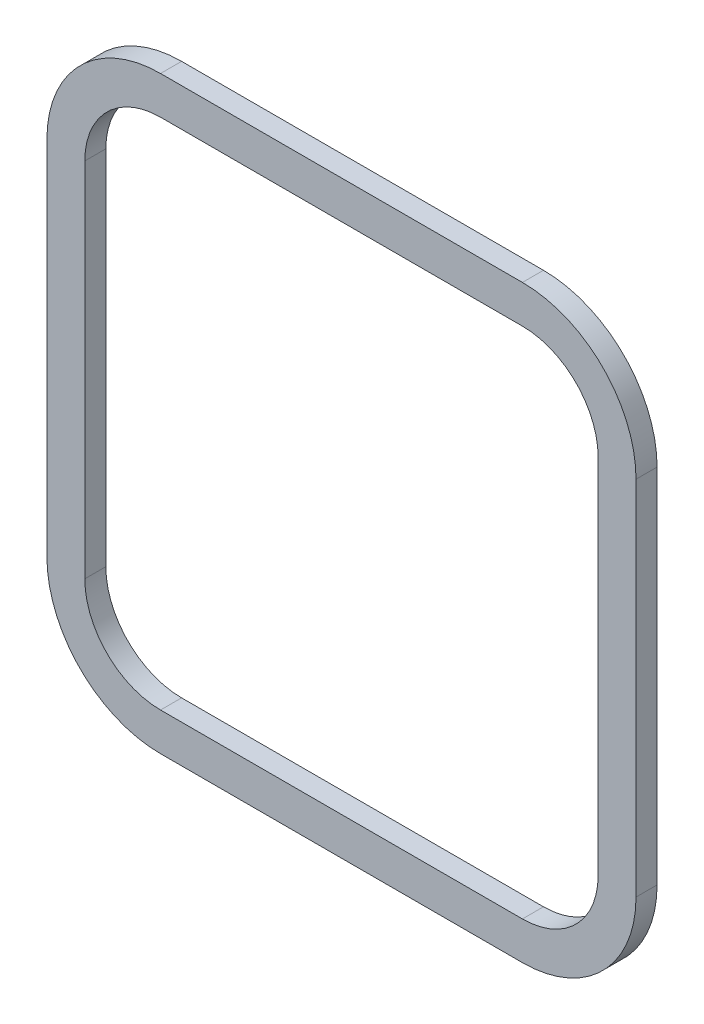
ISO-10303-21;
HEADER;
FILE_DESCRIPTION(('STEP AP214'),'2;1');
FILE_NAME('part.step','',(''),(''),'','','');
FILE_SCHEMA(('AUTOMOTIVE_DESIGN { 1 0 10303 214 1 1 1 1 }'));
ENDSEC;
DATA;
#1=APPLICATION_CONTEXT('core data for automotive mechanical design processes');
#2=APPLICATION_PROTOCOL_DEFINITION('international standard','automotive_design',2000,#1);
#3=PRODUCT_CONTEXT('',#1,'mechanical');
#4=PRODUCT('Part','Part','',(#3));
#5=PRODUCT_RELATED_PRODUCT_CATEGORY('part','',(#4));
#6=PRODUCT_DEFINITION_FORMATION('','',#4);
#7=PRODUCT_DEFINITION_CONTEXT('part definition',#1,'design');
#8=PRODUCT_DEFINITION('design','',#6,#7);
#9=PRODUCT_DEFINITION_SHAPE('','',#8);
#10=(LENGTH_UNIT() NAMED_UNIT(*) SI_UNIT(.MILLI.,.METRE.));
#11=(NAMED_UNIT(*) PLANE_ANGLE_UNIT() SI_UNIT($,.RADIAN.));
#12=(NAMED_UNIT(*) SI_UNIT($,.STERADIAN.) SOLID_ANGLE_UNIT());
#13=UNCERTAINTY_MEASURE_WITH_UNIT(LENGTH_MEASURE(1.E-05),#10,'distance_accuracy_value','');
#14=(GEOMETRIC_REPRESENTATION_CONTEXT(3) GLOBAL_UNCERTAINTY_ASSIGNED_CONTEXT((#13)) GLOBAL_UNIT_ASSIGNED_CONTEXT((#10,
#11,#12)) REPRESENTATION_CONTEXT('',''));
#15=CARTESIAN_POINT('',(0.,0.,0.));
#16=DIRECTION('',(0.,0.,1.));
#17=DIRECTION('',(1.,0.,0.));
#18=AXIS2_PLACEMENT_3D('',#15,#16,#17);
#19=CARTESIAN_POINT('',(-140.,-140.,10.));
#20=DIRECTION('',(0.,0.,1.));
#21=DIRECTION('',(1.,0.,0.));
#22=AXIS2_PLACEMENT_3D('',#19,#20,#21);
#23=PLANE('',#22);
#24=DIRECTION('',(0.,-1.,0.));
#25=VECTOR('',#24,1.);
#26=CARTESIAN_POINT('',(-140.,140.,10.));
#27=LINE('',#26,#25);
#28=CARTESIAN_POINT('',(-140.,86.,10.));
#29=VERTEX_POINT('',#28);
#30=CARTESIAN_POINT('',(-140.,-86.,10.));
#31=VERTEX_POINT('',#30);
#32=EDGE_CURVE('E246',#29,#31,#27,.T.);
#33=ORIENTED_EDGE('',*,*,#32,.T.);
#34=CARTESIAN_POINT('',(-86.0000000000001,-86.,10.));
#35=DIRECTION('',(0.,0.,1.));
#36=DIRECTION('',(1.,0.,0.));
#37=AXIS2_PLACEMENT_3D('',#34,#35,#36);
#38=CIRCLE('',#37,54.);
#39=CARTESIAN_POINT('',(-86.0000000000001,-140.,10.));
#40=VERTEX_POINT('',#39);
#41=EDGE_CURVE('E230',#31,#40,#38,.T.);
#42=ORIENTED_EDGE('',*,*,#41,.T.);
#43=DIRECTION('',(1.,0.,0.));
#44=VECTOR('',#43,1.);
#45=CARTESIAN_POINT('',(-140.,-140.,10.));
#46=LINE('',#45,#44);
#47=CARTESIAN_POINT('',(86.0000000000001,-140.,10.));
#48=VERTEX_POINT('',#47);
#49=EDGE_CURVE('E249',#40,#48,#46,.T.);
#50=ORIENTED_EDGE('',*,*,#49,.T.);
#51=CARTESIAN_POINT('',(86.0000000000001,-86.,10.));
#52=DIRECTION('',(0.,0.,1.));
#53=DIRECTION('',(1.,0.,0.));
#54=AXIS2_PLACEMENT_3D('',#51,#52,#53);
#55=CIRCLE('',#54,54.);
#56=CARTESIAN_POINT('',(140.,-86.,10.));
#57=VERTEX_POINT('',#56);
#58=EDGE_CURVE('E228',#48,#57,#55,.T.);
#59=ORIENTED_EDGE('',*,*,#58,.T.);
#60=DIRECTION('',(0.,1.,0.));
#61=VECTOR('',#60,1.);
#62=CARTESIAN_POINT('',(140.,140.,10.));
#63=LINE('',#62,#61);
#64=CARTESIAN_POINT('',(140.,86.0000000000001,10.));
#65=VERTEX_POINT('',#64);
#66=EDGE_CURVE('E176',#57,#65,#63,.T.);
#67=ORIENTED_EDGE('',*,*,#66,.T.);
#68=CARTESIAN_POINT('',(86.,86.,10.));
#69=DIRECTION('',(0.,0.,1.));
#70=DIRECTION('',(1.,0.,0.));
#71=AXIS2_PLACEMENT_3D('',#68,#69,#70);
#72=CIRCLE('',#71,54.);
#73=CARTESIAN_POINT('',(86.,140.,10.));
#74=VERTEX_POINT('',#73);
#75=EDGE_CURVE('E54',#65,#74,#72,.T.);
#76=ORIENTED_EDGE('',*,*,#75,.T.);
#77=DIRECTION('',(-1.,0.,0.));
#78=VECTOR('',#77,1.);
#79=CARTESIAN_POINT('',(-140.,140.,10.));
#80=LINE('',#79,#78);
#81=CARTESIAN_POINT('',(-86.0000000000001,140.,10.));
#82=VERTEX_POINT('',#81);
#83=EDGE_CURVE('E172',#74,#82,#80,.T.);
#84=ORIENTED_EDGE('',*,*,#83,.T.);
#85=CARTESIAN_POINT('',(-86.0000000000001,86.,10.));
#86=DIRECTION('',(0.,0.,1.));
#87=DIRECTION('',(1.,0.,0.));
#88=AXIS2_PLACEMENT_3D('',#85,#86,#87);
#89=CIRCLE('',#88,54.);
#90=EDGE_CURVE('E226',#82,#29,#89,.T.);
#91=ORIENTED_EDGE('',*,*,#90,.T.);
#92=EDGE_LOOP('',(#33,#42,#50,#59,#67,#76,#84,#91));
#93=FACE_BOUND('',#92,.T.);
#94=DIRECTION('',(1.,0.,0.));
#95=VECTOR('',#94,1.);
#96=CARTESIAN_POINT('',(-122.,-122.,10.));
#97=LINE('',#96,#95);
#98=CARTESIAN_POINT('',(-86.,-122.,10.));
#99=VERTEX_POINT('',#98);
#100=CARTESIAN_POINT('',(86.,-122.,10.));
#101=VERTEX_POINT('',#100);
#102=EDGE_CURVE('E276',#99,#101,#97,.T.);
#103=ORIENTED_EDGE('',*,*,#102,.F.);
#104=CARTESIAN_POINT('',(-86.,-86.,10.));
#105=DIRECTION('',(0.,0.,1.));
#106=DIRECTION('',(1.,0.,0.));
#107=AXIS2_PLACEMENT_3D('',#104,#105,#106);
#108=CIRCLE('',#107,36.);
#109=CARTESIAN_POINT('',(-122.,-85.9999999999999,10.));
#110=VERTEX_POINT('',#109);
#111=EDGE_CURVE('E158',#99,#110,#108,.F.);
#112=ORIENTED_EDGE('',*,*,#111,.T.);
#113=DIRECTION('',(0.,-1.,0.));
#114=VECTOR('',#113,1.);
#115=CARTESIAN_POINT('',(-122.,122.,10.));
#116=LINE('',#115,#114);
#117=CARTESIAN_POINT('',(-122.,86.,10.));
#118=VERTEX_POINT('',#117);
#119=EDGE_CURVE('E265',#118,#110,#116,.T.);
#120=ORIENTED_EDGE('',*,*,#119,.F.);
#121=CARTESIAN_POINT('',(-86.,86.,10.));
#122=DIRECTION('',(0.,0.,1.));
#123=DIRECTION('',(1.,0.,0.));
#124=AXIS2_PLACEMENT_3D('',#121,#122,#123);
#125=CIRCLE('',#124,36.);
#126=CARTESIAN_POINT('',(-86.0000000000001,122.,10.));
#127=VERTEX_POINT('',#126);
#128=EDGE_CURVE('E157',#118,#127,#125,.F.);
#129=ORIENTED_EDGE('',*,*,#128,.T.);
#130=DIRECTION('',(-1.,0.,0.));
#131=VECTOR('',#130,1.);
#132=CARTESIAN_POINT('',(-122.,122.,10.));
#133=LINE('',#132,#131);
#134=CARTESIAN_POINT('',(85.9999999999999,122.,10.));
#135=VERTEX_POINT('',#134);
#136=EDGE_CURVE('E259',#135,#127,#133,.T.);
#137=ORIENTED_EDGE('',*,*,#136,.F.);
#138=CARTESIAN_POINT('',(86.,86.,10.));
#139=DIRECTION('',(0.,0.,1.));
#140=DIRECTION('',(1.,0.,0.));
#141=AXIS2_PLACEMENT_3D('',#138,#139,#140);
#142=CIRCLE('',#141,36.);
#143=CARTESIAN_POINT('',(122.,86.,10.));
#144=VERTEX_POINT('',#143);
#145=EDGE_CURVE('E201',#135,#144,#142,.F.);
#146=ORIENTED_EDGE('',*,*,#145,.T.);
#147=DIRECTION('',(0.,1.,0.));
#148=VECTOR('',#147,1.);
#149=CARTESIAN_POINT('',(122.,122.,10.));
#150=LINE('',#149,#148);
#151=CARTESIAN_POINT('',(122.,-85.9999999999999,10.));
#152=VERTEX_POINT('',#151);
#153=EDGE_CURVE('E273',#152,#144,#150,.T.);
#154=ORIENTED_EDGE('',*,*,#153,.F.);
#155=CARTESIAN_POINT('',(86.,-86.,10.));
#156=DIRECTION('',(0.,0.,1.));
#157=DIRECTION('',(1.,0.,0.));
#158=AXIS2_PLACEMENT_3D('',#155,#156,#157);
#159=CIRCLE('',#158,36.);
#160=EDGE_CURVE('E205',#152,#101,#159,.F.);
#161=ORIENTED_EDGE('',*,*,#160,.T.);
#162=EDGE_LOOP('',(#103,#112,#120,#129,#137,#146,#154,#161));
#163=FACE_BOUND('',#162,.T.);
#164=ADVANCED_FACE('F34',(#93,#163),#23,.T.);
#165=CARTESIAN_POINT('',(-140.,-140.,0.));
#166=DIRECTION('',(0.,0.,1.));
#167=DIRECTION('',(1.,0.,0.));
#168=AXIS2_PLACEMENT_3D('',#165,#166,#167);
#169=PLANE('',#168);
#170=DIRECTION('',(1.,0.,0.));
#171=VECTOR('',#170,1.);
#172=CARTESIAN_POINT('',(-140.,-140.,0.));
#173=LINE('',#172,#171);
#174=CARTESIAN_POINT('',(-86.0000000000001,-140.,0.));
#175=VERTEX_POINT('',#174);
#176=CARTESIAN_POINT('',(86.0000000000001,-140.,0.));
#177=VERTEX_POINT('',#176);
#178=EDGE_CURVE('E251',#175,#177,#173,.T.);
#179=ORIENTED_EDGE('',*,*,#178,.F.);
#180=CARTESIAN_POINT('',(-86.0000000000001,-86.,0.));
#181=DIRECTION('',(0.,0.,1.));
#182=DIRECTION('',(1.,0.,0.));
#183=AXIS2_PLACEMENT_3D('',#180,#181,#182);
#184=CIRCLE('',#183,54.);
#185=CARTESIAN_POINT('',(-140.,-86.,0.));
#186=VERTEX_POINT('',#185);
#187=EDGE_CURVE('E218',#175,#186,#184,.F.);
#188=ORIENTED_EDGE('',*,*,#187,.T.);
#189=DIRECTION('',(0.,-1.,0.));
#190=VECTOR('',#189,1.);
#191=CARTESIAN_POINT('',(-140.,140.,0.));
#192=LINE('',#191,#190);
#193=CARTESIAN_POINT('',(-140.,86.,0.));
#194=VERTEX_POINT('',#193);
#195=EDGE_CURVE('E255',#194,#186,#192,.T.);
#196=ORIENTED_EDGE('',*,*,#195,.F.);
#197=CARTESIAN_POINT('',(-86.0000000000001,86.,0.));
#198=DIRECTION('',(0.,0.,1.));
#199=DIRECTION('',(1.,0.,0.));
#200=AXIS2_PLACEMENT_3D('',#197,#198,#199);
#201=CIRCLE('',#200,54.);
#202=CARTESIAN_POINT('',(-86.0000000000001,140.,0.));
#203=VERTEX_POINT('',#202);
#204=EDGE_CURVE('E214',#194,#203,#201,.F.);
#205=ORIENTED_EDGE('',*,*,#204,.T.);
#206=DIRECTION('',(-1.,0.,0.));
#207=VECTOR('',#206,1.);
#208=CARTESIAN_POINT('',(-140.,140.,0.));
#209=LINE('',#208,#207);
#210=CARTESIAN_POINT('',(86.,140.,0.));
#211=VERTEX_POINT('',#210);
#212=EDGE_CURVE('E179',#211,#203,#209,.T.);
#213=ORIENTED_EDGE('',*,*,#212,.F.);
#214=CARTESIAN_POINT('',(86.,86.,0.));
#215=DIRECTION('',(0.,0.,1.));
#216=DIRECTION('',(1.,0.,0.));
#217=AXIS2_PLACEMENT_3D('',#214,#215,#216);
#218=CIRCLE('',#217,54.);
#219=CARTESIAN_POINT('',(140.,86.0000000000001,0.));
#220=VERTEX_POINT('',#219);
#221=EDGE_CURVE('E212',#211,#220,#218,.F.);
#222=ORIENTED_EDGE('',*,*,#221,.T.);
#223=DIRECTION('',(0.,1.,0.));
#224=VECTOR('',#223,1.);
#225=CARTESIAN_POINT('',(140.,140.,0.));
#226=LINE('',#225,#224);
#227=CARTESIAN_POINT('',(140.,-86.,0.));
#228=VERTEX_POINT('',#227);
#229=EDGE_CURVE('E247',#228,#220,#226,.T.);
#230=ORIENTED_EDGE('',*,*,#229,.F.);
#231=CARTESIAN_POINT('',(86.0000000000001,-86.,0.));
#232=DIRECTION('',(0.,0.,1.));
#233=DIRECTION('',(1.,0.,0.));
#234=AXIS2_PLACEMENT_3D('',#231,#232,#233);
#235=CIRCLE('',#234,54.);
#236=EDGE_CURVE('E216',#228,#177,#235,.F.);
#237=ORIENTED_EDGE('',*,*,#236,.T.);
#238=EDGE_LOOP('',(#179,#188,#196,#205,#213,#222,#230,#237));
#239=FACE_BOUND('',#238,.T.);
#240=DIRECTION('',(-1.,0.,0.));
#241=VECTOR('',#240,1.);
#242=CARTESIAN_POINT('',(-122.,122.,0.));
#243=LINE('',#242,#241);
#244=CARTESIAN_POINT('',(85.9999999999999,122.,0.));
#245=VERTEX_POINT('',#244);
#246=CARTESIAN_POINT('',(-86.0000000000001,122.,0.));
#247=VERTEX_POINT('',#246);
#248=EDGE_CURVE('E152',#245,#247,#243,.T.);
#249=ORIENTED_EDGE('',*,*,#248,.T.);
#250=CARTESIAN_POINT('',(-86.,86.,0.));
#251=DIRECTION('',(0.,0.,1.));
#252=DIRECTION('',(1.,0.,0.));
#253=AXIS2_PLACEMENT_3D('',#250,#251,#252);
#254=CIRCLE('',#253,36.);
#255=CARTESIAN_POINT('',(-122.,86.,0.));
#256=VERTEX_POINT('',#255);
#257=EDGE_CURVE('E147',#247,#256,#254,.T.);
#258=ORIENTED_EDGE('',*,*,#257,.T.);
#259=DIRECTION('',(0.,-1.,0.));
#260=VECTOR('',#259,1.);
#261=CARTESIAN_POINT('',(-122.,122.,0.));
#262=LINE('',#261,#260);
#263=CARTESIAN_POINT('',(-122.,-85.9999999999999,0.));
#264=VERTEX_POINT('',#263);
#265=EDGE_CURVE('E150',#256,#264,#262,.T.);
#266=ORIENTED_EDGE('',*,*,#265,.T.);
#267=CARTESIAN_POINT('',(-86.,-86.,0.));
#268=DIRECTION('',(0.,0.,1.));
#269=DIRECTION('',(1.,0.,0.));
#270=AXIS2_PLACEMENT_3D('',#267,#268,#269);
#271=CIRCLE('',#270,36.);
#272=CARTESIAN_POINT('',(-86.,-122.,0.));
#273=VERTEX_POINT('',#272);
#274=EDGE_CURVE('E195',#264,#273,#271,.T.);
#275=ORIENTED_EDGE('',*,*,#274,.T.);
#276=DIRECTION('',(1.,0.,0.));
#277=VECTOR('',#276,1.);
#278=CARTESIAN_POINT('',(-122.,-122.,0.));
#279=LINE('',#278,#277);
#280=CARTESIAN_POINT('',(86.,-122.,0.));
#281=VERTEX_POINT('',#280);
#282=EDGE_CURVE('E168',#273,#281,#279,.T.);
#283=ORIENTED_EDGE('',*,*,#282,.T.);
#284=CARTESIAN_POINT('',(86.,-86.,0.));
#285=DIRECTION('',(0.,0.,1.));
#286=DIRECTION('',(1.,0.,0.));
#287=AXIS2_PLACEMENT_3D('',#284,#285,#286);
#288=CIRCLE('',#287,36.);
#289=CARTESIAN_POINT('',(122.,-85.9999999999999,0.));
#290=VERTEX_POINT('',#289);
#291=EDGE_CURVE('E203',#281,#290,#288,.T.);
#292=ORIENTED_EDGE('',*,*,#291,.T.);
#293=DIRECTION('',(0.,1.,0.));
#294=VECTOR('',#293,1.);
#295=CARTESIAN_POINT('',(122.,122.,0.));
#296=LINE('',#295,#294);
#297=CARTESIAN_POINT('',(122.,86.,0.));
#298=VERTEX_POINT('',#297);
#299=EDGE_CURVE('E266',#290,#298,#296,.T.);
#300=ORIENTED_EDGE('',*,*,#299,.T.);
#301=CARTESIAN_POINT('',(86.,86.,0.));
#302=DIRECTION('',(0.,0.,1.));
#303=DIRECTION('',(1.,0.,0.));
#304=AXIS2_PLACEMENT_3D('',#301,#302,#303);
#305=CIRCLE('',#304,36.);
#306=EDGE_CURVE('E199',#298,#245,#305,.T.);
#307=ORIENTED_EDGE('',*,*,#306,.T.);
#308=EDGE_LOOP('',(#249,#258,#266,#275,#283,#292,#300,#307));
#309=FACE_BOUND('',#308,.T.);
#310=ADVANCED_FACE('F149',(#239,#309),#169,.F.);
#311=CARTESIAN_POINT('',(-140.,140.,10.));
#312=DIRECTION('',(1.,0.,0.));
#313=DIRECTION('',(0.,0.,-1.));
#314=AXIS2_PLACEMENT_3D('',#311,#312,#313);
#315=PLANE('',#314);
#316=ORIENTED_EDGE('',*,*,#195,.T.);
#317=DIRECTION('',(0.,0.,-1.));
#318=VECTOR('',#317,1.);
#319=CARTESIAN_POINT('',(-140.,-86.,10.));
#320=LINE('',#319,#318);
#321=EDGE_CURVE('E223',#186,#31,#320,.F.);
#322=ORIENTED_EDGE('',*,*,#321,.T.);
#323=ORIENTED_EDGE('',*,*,#32,.F.);
#324=DIRECTION('',(0.,0.,-1.));
#325=VECTOR('',#324,1.);
#326=CARTESIAN_POINT('',(-140.,86.,10.));
#327=LINE('',#326,#325);
#328=EDGE_CURVE('E220',#29,#194,#327,.T.);
#329=ORIENTED_EDGE('',*,*,#328,.T.);
#330=EDGE_LOOP('',(#316,#322,#323,#329));
#331=FACE_BOUND('',#330,.T.);
#332=ADVANCED_FACE('F310',(#331),#315,.F.);
#333=CARTESIAN_POINT('',(-140.,-140.,10.));
#334=DIRECTION('',(0.,1.,0.));
#335=DIRECTION('',(0.,0.,1.));
#336=AXIS2_PLACEMENT_3D('',#333,#334,#335);
#337=PLANE('',#336);
#338=ORIENTED_EDGE('',*,*,#49,.F.);
#339=DIRECTION('',(0.,0.,-1.));
#340=VECTOR('',#339,1.);
#341=CARTESIAN_POINT('',(-86.0000000000001,-140.,10.));
#342=LINE('',#341,#340);
#343=EDGE_CURVE('E209',#40,#175,#342,.T.);
#344=ORIENTED_EDGE('',*,*,#343,.T.);
#345=ORIENTED_EDGE('',*,*,#178,.T.);
#346=DIRECTION('',(0.,0.,-1.));
#347=VECTOR('',#346,1.);
#348=CARTESIAN_POINT('',(86.0000000000001,-140.,10.));
#349=LINE('',#348,#347);
#350=EDGE_CURVE('E207',#177,#48,#349,.F.);
#351=ORIENTED_EDGE('',*,*,#350,.T.);
#352=EDGE_LOOP('',(#338,#344,#345,#351));
#353=FACE_BOUND('',#352,.T.);
#354=ADVANCED_FACE('F320',(#353),#337,.F.);
#355=CARTESIAN_POINT('',(140.,140.,10.));
#356=DIRECTION('',(-1.,0.,0.));
#357=DIRECTION('',(0.,-1.,0.));
#358=AXIS2_PLACEMENT_3D('',#355,#356,#357);
#359=PLANE('',#358);
#360=ORIENTED_EDGE('',*,*,#66,.F.);
#361=DIRECTION('',(0.,0.,-1.));
#362=VECTOR('',#361,1.);
#363=CARTESIAN_POINT('',(140.,-86.,10.));
#364=LINE('',#363,#362);
#365=EDGE_CURVE('E234',#57,#228,#364,.T.);
#366=ORIENTED_EDGE('',*,*,#365,.T.);
#367=ORIENTED_EDGE('',*,*,#229,.T.);
#368=DIRECTION('',(0.,0.,-1.));
#369=VECTOR('',#368,1.);
#370=CARTESIAN_POINT('',(140.,86.0000000000001,10.));
#371=LINE('',#370,#369);
#372=EDGE_CURVE('E232',#220,#65,#371,.F.);
#373=ORIENTED_EDGE('',*,*,#372,.T.);
#374=EDGE_LOOP('',(#360,#366,#367,#373));
#375=FACE_BOUND('',#374,.T.);
#376=ADVANCED_FACE('F317',(#375),#359,.F.);
#377=CARTESIAN_POINT('',(-140.,140.,10.));
#378=DIRECTION('',(0.,-1.,0.));
#379=DIRECTION('',(0.,0.,-1.));
#380=AXIS2_PLACEMENT_3D('',#377,#378,#379);
#381=PLANE('',#380);
#382=ORIENTED_EDGE('',*,*,#212,.T.);
#383=DIRECTION('',(0.,0.,-1.));
#384=VECTOR('',#383,1.);
#385=CARTESIAN_POINT('',(-86.0000000000001,140.,10.));
#386=LINE('',#385,#384);
#387=EDGE_CURVE('E11',#203,#82,#386,.F.);
#388=ORIENTED_EDGE('',*,*,#387,.T.);
#389=ORIENTED_EDGE('',*,*,#83,.F.);
#390=DIRECTION('',(0.,0.,-1.));
#391=VECTOR('',#390,1.);
#392=CARTESIAN_POINT('',(86.,140.,10.));
#393=LINE('',#392,#391);
#394=EDGE_CURVE('E42',#74,#211,#393,.T.);
#395=ORIENTED_EDGE('',*,*,#394,.T.);
#396=EDGE_LOOP('',(#382,#388,#389,#395));
#397=FACE_BOUND('',#396,.T.);
#398=ADVANCED_FACE('F239',(#397),#381,.F.);
#399=CARTESIAN_POINT('',(-122.,122.,10.));
#400=DIRECTION('',(1.,0.,0.));
#401=DIRECTION('',(0.,1.,0.));
#402=AXIS2_PLACEMENT_3D('',#399,#400,#401);
#403=PLANE('',#402);
#404=ORIENTED_EDGE('',*,*,#119,.T.);
#405=DIRECTION('',(0.,0.,-1.));
#406=VECTOR('',#405,1.);
#407=CARTESIAN_POINT('',(-122.,-86.,0.));
#408=LINE('',#407,#406);
#409=EDGE_CURVE('E167',#110,#264,#408,.T.);
#410=ORIENTED_EDGE('',*,*,#409,.T.);
#411=ORIENTED_EDGE('',*,*,#265,.F.);
#412=DIRECTION('',(0.,0.,-1.));
#413=VECTOR('',#412,1.);
#414=CARTESIAN_POINT('',(-122.,86.,10.));
#415=LINE('',#414,#413);
#416=EDGE_CURVE('E164',#256,#118,#415,.F.);
#417=ORIENTED_EDGE('',*,*,#416,.T.);
#418=EDGE_LOOP('',(#404,#410,#411,#417));
#419=FACE_BOUND('',#418,.T.);
#420=ADVANCED_FACE('F163',(#419),#403,.T.);
#421=CARTESIAN_POINT('',(-122.,-122.,10.));
#422=DIRECTION('',(0.,1.,0.));
#423=DIRECTION('',(0.,0.,1.));
#424=AXIS2_PLACEMENT_3D('',#421,#422,#423);
#425=PLANE('',#424);
#426=ORIENTED_EDGE('',*,*,#282,.F.);
#427=DIRECTION('',(0.,0.,-1.));
#428=VECTOR('',#427,1.);
#429=CARTESIAN_POINT('',(-86.,-122.,10.));
#430=LINE('',#429,#428);
#431=EDGE_CURVE('E184',#273,#99,#430,.F.);
#432=ORIENTED_EDGE('',*,*,#431,.T.);
#433=ORIENTED_EDGE('',*,*,#102,.T.);
#434=DIRECTION('',(0.,0.,-1.));
#435=VECTOR('',#434,1.);
#436=CARTESIAN_POINT('',(86.,-122.,0.));
#437=LINE('',#436,#435);
#438=EDGE_CURVE('E174',#101,#281,#437,.T.);
#439=ORIENTED_EDGE('',*,*,#438,.T.);
#440=EDGE_LOOP('',(#426,#432,#433,#439));
#441=FACE_BOUND('',#440,.T.);
#442=ADVANCED_FACE('F286',(#441),#425,.T.);
#443=CARTESIAN_POINT('',(122.,122.,10.));
#444=DIRECTION('',(-1.,0.,0.));
#445=DIRECTION('',(0.,-1.,0.));
#446=AXIS2_PLACEMENT_3D('',#443,#444,#445);
#447=PLANE('',#446);
#448=ORIENTED_EDGE('',*,*,#153,.T.);
#449=DIRECTION('',(0.,0.,-1.));
#450=VECTOR('',#449,1.);
#451=CARTESIAN_POINT('',(122.,86.,0.));
#452=LINE('',#451,#450);
#453=EDGE_CURVE('E192',#144,#298,#452,.T.);
#454=ORIENTED_EDGE('',*,*,#453,.T.);
#455=ORIENTED_EDGE('',*,*,#299,.F.);
#456=DIRECTION('',(0.,0.,-1.));
#457=VECTOR('',#456,1.);
#458=CARTESIAN_POINT('',(122.,-86.,10.));
#459=LINE('',#458,#457);
#460=EDGE_CURVE('E190',#290,#152,#459,.F.);
#461=ORIENTED_EDGE('',*,*,#460,.T.);
#462=EDGE_LOOP('',(#448,#454,#455,#461));
#463=FACE_BOUND('',#462,.T.);
#464=ADVANCED_FACE('F295',(#463),#447,.T.);
#465=CARTESIAN_POINT('',(-122.,122.,10.));
#466=DIRECTION('',(0.,-1.,0.));
#467=DIRECTION('',(0.,0.,-1.));
#468=AXIS2_PLACEMENT_3D('',#465,#466,#467);
#469=PLANE('',#468);
#470=ORIENTED_EDGE('',*,*,#136,.T.);
#471=DIRECTION('',(0.,0.,-1.));
#472=VECTOR('',#471,1.);
#473=CARTESIAN_POINT('',(-86.,122.,0.));
#474=LINE('',#473,#472);
#475=EDGE_CURVE('E188',#127,#247,#474,.T.);
#476=ORIENTED_EDGE('',*,*,#475,.T.);
#477=ORIENTED_EDGE('',*,*,#248,.F.);
#478=DIRECTION('',(0.,0.,-1.));
#479=VECTOR('',#478,1.);
#480=CARTESIAN_POINT('',(86.,122.,10.));
#481=LINE('',#480,#479);
#482=EDGE_CURVE('E186',#245,#135,#481,.F.);
#483=ORIENTED_EDGE('',*,*,#482,.T.);
#484=EDGE_LOOP('',(#470,#476,#477,#483));
#485=FACE_BOUND('',#484,.T.);
#486=ADVANCED_FACE('F303',(#485),#469,.T.);
#487=CARTESIAN_POINT('',(-86.,-86.,10.));
#488=DIRECTION('',(0.,0.,1.));
#489=DIRECTION('',(1.,0.,0.));
#490=AXIS2_PLACEMENT_3D('',#487,#488,#489);
#491=CYLINDRICAL_SURFACE('',#490,36.);
#492=ORIENTED_EDGE('',*,*,#111,.F.);
#493=ORIENTED_EDGE('',*,*,#431,.F.);
#494=ORIENTED_EDGE('',*,*,#274,.F.);
#495=ORIENTED_EDGE('',*,*,#409,.F.);
#496=EDGE_LOOP('',(#492,#493,#494,#495));
#497=FACE_BOUND('',#496,.T.);
#498=ADVANCED_FACE('F282',(#497),#491,.F.);
#499=CARTESIAN_POINT('',(-86.,86.,10.));
#500=DIRECTION('',(0.,0.,1.));
#501=DIRECTION('',(1.,0.,0.));
#502=AXIS2_PLACEMENT_3D('',#499,#500,#501);
#503=CYLINDRICAL_SURFACE('',#502,36.);
#504=ORIENTED_EDGE('',*,*,#128,.F.);
#505=ORIENTED_EDGE('',*,*,#416,.F.);
#506=ORIENTED_EDGE('',*,*,#257,.F.);
#507=ORIENTED_EDGE('',*,*,#475,.F.);
#508=EDGE_LOOP('',(#504,#505,#506,#507));
#509=FACE_BOUND('',#508,.T.);
#510=ADVANCED_FACE('F171',(#509),#503,.F.);
#511=CARTESIAN_POINT('',(86.,86.,10.));
#512=DIRECTION('',(0.,0.,1.));
#513=DIRECTION('',(1.,0.,0.));
#514=AXIS2_PLACEMENT_3D('',#511,#512,#513);
#515=CYLINDRICAL_SURFACE('',#514,36.);
#516=ORIENTED_EDGE('',*,*,#145,.F.);
#517=ORIENTED_EDGE('',*,*,#482,.F.);
#518=ORIENTED_EDGE('',*,*,#306,.F.);
#519=ORIENTED_EDGE('',*,*,#453,.F.);
#520=EDGE_LOOP('',(#516,#517,#518,#519));
#521=FACE_BOUND('',#520,.T.);
#522=ADVANCED_FACE('F300',(#521),#515,.F.);
#523=CARTESIAN_POINT('',(86.,-86.,10.));
#524=DIRECTION('',(0.,0.,1.));
#525=DIRECTION('',(1.,0.,0.));
#526=AXIS2_PLACEMENT_3D('',#523,#524,#525);
#527=CYLINDRICAL_SURFACE('',#526,36.);
#528=ORIENTED_EDGE('',*,*,#160,.F.);
#529=ORIENTED_EDGE('',*,*,#460,.F.);
#530=ORIENTED_EDGE('',*,*,#291,.F.);
#531=ORIENTED_EDGE('',*,*,#438,.F.);
#532=EDGE_LOOP('',(#528,#529,#530,#531));
#533=FACE_BOUND('',#532,.T.);
#534=ADVANCED_FACE('F291',(#533),#527,.F.);
#535=CARTESIAN_POINT('',(-86.0000000000001,-86.,10.));
#536=DIRECTION('',(0.,0.,-1.));
#537=DIRECTION('',(-1.,0.,0.));
#538=AXIS2_PLACEMENT_3D('',#535,#536,#537);
#539=CYLINDRICAL_SURFACE('',#538,54.);
#540=ORIENTED_EDGE('',*,*,#41,.F.);
#541=ORIENTED_EDGE('',*,*,#321,.F.);
#542=ORIENTED_EDGE('',*,*,#187,.F.);
#543=ORIENTED_EDGE('',*,*,#343,.F.);
#544=EDGE_LOOP('',(#540,#541,#542,#543));
#545=FACE_BOUND('',#544,.T.);
#546=ADVANCED_FACE('F335',(#545),#539,.T.);
#547=CARTESIAN_POINT('',(86.0000000000001,-86.,10.));
#548=DIRECTION('',(0.,0.,-1.));
#549=DIRECTION('',(-1.,0.,0.));
#550=AXIS2_PLACEMENT_3D('',#547,#548,#549);
#551=CYLINDRICAL_SURFACE('',#550,54.);
#552=ORIENTED_EDGE('',*,*,#58,.F.);
#553=ORIENTED_EDGE('',*,*,#350,.F.);
#554=ORIENTED_EDGE('',*,*,#236,.F.);
#555=ORIENTED_EDGE('',*,*,#365,.F.);
#556=EDGE_LOOP('',(#552,#553,#554,#555));
#557=FACE_BOUND('',#556,.T.);
#558=ADVANCED_FACE('F338',(#557),#551,.T.);
#559=CARTESIAN_POINT('',(-86.0000000000001,86.,10.));
#560=DIRECTION('',(0.,0.,-1.));
#561=DIRECTION('',(-1.,0.,0.));
#562=AXIS2_PLACEMENT_3D('',#559,#560,#561);
#563=CYLINDRICAL_SURFACE('',#562,54.);
#564=ORIENTED_EDGE('',*,*,#90,.F.);
#565=ORIENTED_EDGE('',*,*,#387,.F.);
#566=ORIENTED_EDGE('',*,*,#204,.F.);
#567=ORIENTED_EDGE('',*,*,#328,.F.);
#568=EDGE_LOOP('',(#564,#565,#566,#567));
#569=FACE_BOUND('',#568,.T.);
#570=ADVANCED_FACE('F341',(#569),#563,.T.);
#571=CARTESIAN_POINT('',(86.,86.,10.));
#572=DIRECTION('',(0.,0.,-1.));
#573=DIRECTION('',(-1.,0.,0.));
#574=AXIS2_PLACEMENT_3D('',#571,#572,#573);
#575=CYLINDRICAL_SURFACE('',#574,54.);
#576=ORIENTED_EDGE('',*,*,#75,.F.);
#577=ORIENTED_EDGE('',*,*,#372,.F.);
#578=ORIENTED_EDGE('',*,*,#221,.F.);
#579=ORIENTED_EDGE('',*,*,#394,.F.);
#580=EDGE_LOOP('',(#576,#577,#578,#579));
#581=FACE_BOUND('',#580,.T.);
#582=ADVANCED_FACE('F36',(#581),#575,.T.);
#583=CLOSED_SHELL('',(#164,#310,#332,#354,#376,#398,#420,#442,#464,#486,#498,#510,#522,#534,
#546,#558,#570,#582));
#584=MANIFOLD_SOLID_BREP('B2',#583);
#585=ADVANCED_BREP_SHAPE_REPRESENTATION('',(#18,#584),#14);
#586=SHAPE_DEFINITION_REPRESENTATION(#9,#585);
ENDSEC;
END-ISO-10303-21;
